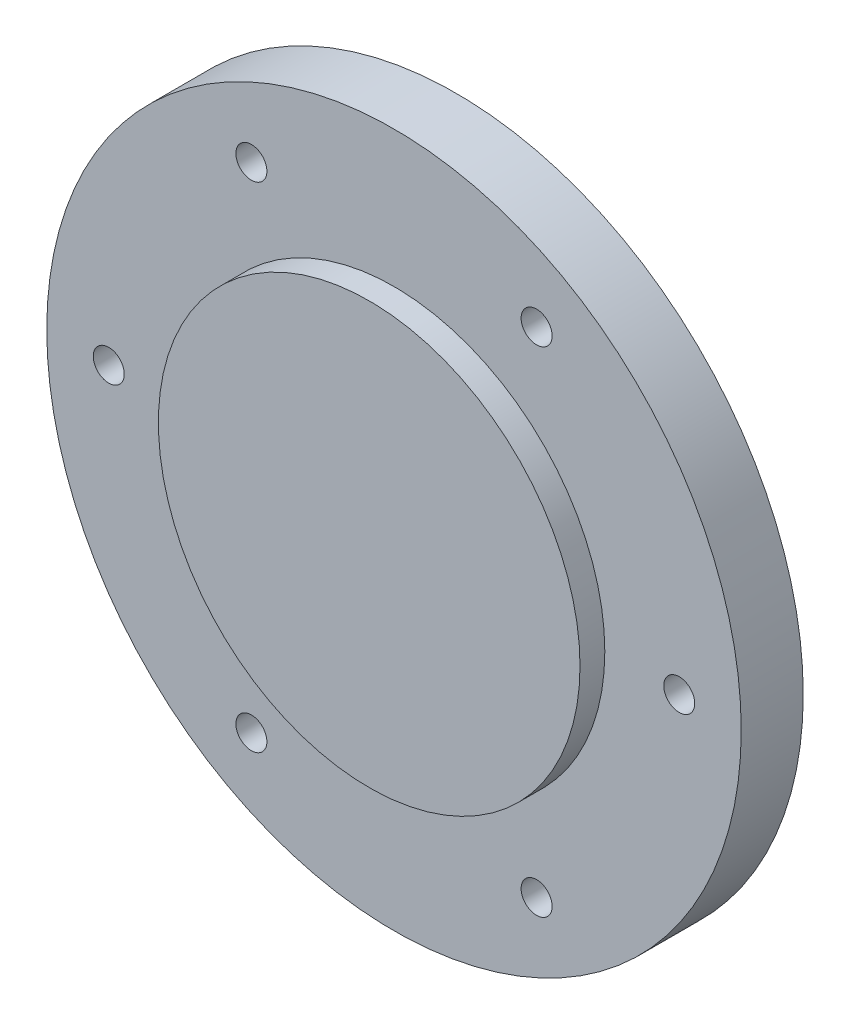
ISO-10303-21;
HEADER;
FILE_DESCRIPTION(('STEP AP214'),'2;1');
FILE_NAME('part.step','',(''),(''),'','','');
FILE_SCHEMA(('AUTOMOTIVE_DESIGN { 1 0 10303 214 1 1 1 1 }'));
ENDSEC;
DATA;
#1=APPLICATION_CONTEXT('core data for automotive mechanical design processes');
#2=APPLICATION_PROTOCOL_DEFINITION('international standard','automotive_design',2000,#1);
#3=PRODUCT_CONTEXT('',#1,'mechanical');
#4=PRODUCT('Part','Part','',(#3));
#5=PRODUCT_RELATED_PRODUCT_CATEGORY('part','',(#4));
#6=PRODUCT_DEFINITION_FORMATION('','',#4);
#7=PRODUCT_DEFINITION_CONTEXT('part definition',#1,'design');
#8=PRODUCT_DEFINITION('design','',#6,#7);
#9=PRODUCT_DEFINITION_SHAPE('','',#8);
#10=(LENGTH_UNIT() NAMED_UNIT(*) SI_UNIT(.MILLI.,.METRE.));
#11=(NAMED_UNIT(*) PLANE_ANGLE_UNIT() SI_UNIT($,.RADIAN.));
#12=(NAMED_UNIT(*) SI_UNIT($,.STERADIAN.) SOLID_ANGLE_UNIT());
#13=UNCERTAINTY_MEASURE_WITH_UNIT(LENGTH_MEASURE(1.E-05),#10,'distance_accuracy_value','');
#14=(GEOMETRIC_REPRESENTATION_CONTEXT(3) GLOBAL_UNCERTAINTY_ASSIGNED_CONTEXT((#13)) GLOBAL_UNIT_ASSIGNED_CONTEXT((#10,
#11,#12)) REPRESENTATION_CONTEXT('',''));
#15=CARTESIAN_POINT('',(0.,0.,0.));
#16=DIRECTION('',(0.,0.,1.));
#17=DIRECTION('',(1.,0.,0.));
#18=AXIS2_PLACEMENT_3D('',#15,#16,#17);
#19=CARTESIAN_POINT('',(0.,0.,5.));
#20=DIRECTION('',(0.,0.,-1.));
#21=DIRECTION('',(-1.,0.,0.));
#22=AXIS2_PLACEMENT_3D('',#19,#20,#21);
#23=CYLINDRICAL_SURFACE('',#22,28.);
#24=CARTESIAN_POINT('',(0.,0.,5.));
#25=DIRECTION('',(0.,0.,1.));
#26=DIRECTION('',(1.,0.,0.));
#27=AXIS2_PLACEMENT_3D('',#24,#25,#26);
#28=CIRCLE('',#27,28.);
#29=CARTESIAN_POINT('',(28.,0.,5.));
#30=VERTEX_POINT('',#29);
#31=EDGE_CURVE('E42',#30,#30,#28,.T.);
#32=ORIENTED_EDGE('',*,*,#31,.F.);
#33=EDGE_LOOP('',(#32));
#34=FACE_BOUND('',#33,.T.);
#35=CARTESIAN_POINT('',(0.,0.,0.));
#36=DIRECTION('',(0.,0.,1.));
#37=DIRECTION('',(1.,0.,0.));
#38=AXIS2_PLACEMENT_3D('',#35,#36,#37);
#39=CIRCLE('',#38,28.);
#40=CARTESIAN_POINT('',(28.,0.,0.));
#41=VERTEX_POINT('',#40);
#42=EDGE_CURVE('E37',#41,#41,#39,.T.);
#43=ORIENTED_EDGE('',*,*,#42,.T.);
#44=EDGE_LOOP('',(#43));
#45=FACE_BOUND('',#44,.T.);
#46=ADVANCED_FACE('F40',(#34,#45),#23,.T.);
#47=CARTESIAN_POINT('',(0.,0.,5.));
#48=DIRECTION('',(0.,0.,1.));
#49=DIRECTION('',(1.,0.,0.));
#50=AXIS2_PLACEMENT_3D('',#47,#48,#49);
#51=PLANE('',#50);
#52=CARTESIAN_POINT('',(11.5,-19.9185842870421,5.));
#53=DIRECTION('',(0.,0.,1.));
#54=DIRECTION('',(0.499999999999999,-0.866025403784439,0.));
#55=AXIS2_PLACEMENT_3D('',#52,#53,#54);
#56=CIRCLE('',#55,1.25);
#57=CARTESIAN_POINT('',(12.125,-21.0011160417726,5.));
#58=VERTEX_POINT('',#57);
#59=EDGE_CURVE('E66',#58,#58,#56,.T.);
#60=ORIENTED_EDGE('',*,*,#59,.F.);
#61=EDGE_LOOP('',(#60));
#62=FACE_BOUND('',#61,.T.);
#63=CARTESIAN_POINT('',(-11.5,-19.9185842870421,5.));
#64=DIRECTION('',(0.,0.,1.));
#65=DIRECTION('',(-0.5,-0.866025403784438,0.));
#66=AXIS2_PLACEMENT_3D('',#63,#64,#65);
#67=CIRCLE('',#66,1.25);
#68=CARTESIAN_POINT('',(-12.125,-21.0011160417726,5.));
#69=VERTEX_POINT('',#68);
#70=EDGE_CURVE('E75',#69,#69,#67,.T.);
#71=ORIENTED_EDGE('',*,*,#70,.F.);
#72=EDGE_LOOP('',(#71));
#73=FACE_BOUND('',#72,.T.);
#74=CARTESIAN_POINT('',(-23.,0.,5.));
#75=DIRECTION('',(0.,0.,1.));
#76=DIRECTION('',(-1.,0.,0.));
#77=AXIS2_PLACEMENT_3D('',#74,#75,#76);
#78=CIRCLE('',#77,1.25);
#79=CARTESIAN_POINT('',(-24.25,0.,5.));
#80=VERTEX_POINT('',#79);
#81=EDGE_CURVE('E80',#80,#80,#78,.T.);
#82=ORIENTED_EDGE('',*,*,#81,.F.);
#83=EDGE_LOOP('',(#82));
#84=FACE_BOUND('',#83,.T.);
#85=CARTESIAN_POINT('',(-11.5,19.9185842870421,5.));
#86=DIRECTION('',(0.,0.,1.));
#87=DIRECTION('',(-0.5,0.866025403784439,0.));
#88=AXIS2_PLACEMENT_3D('',#85,#86,#87);
#89=CIRCLE('',#88,1.25);
#90=CARTESIAN_POINT('',(-12.125,21.0011160417726,5.));
#91=VERTEX_POINT('',#90);
#92=EDGE_CURVE('E83',#91,#91,#89,.T.);
#93=ORIENTED_EDGE('',*,*,#92,.F.);
#94=EDGE_LOOP('',(#93));
#95=FACE_BOUND('',#94,.T.);
#96=CARTESIAN_POINT('',(11.5,19.9185842870421,5.));
#97=DIRECTION('',(0.,0.,1.));
#98=DIRECTION('',(0.5,0.866025403784439,0.));
#99=AXIS2_PLACEMENT_3D('',#96,#97,#98);
#100=CIRCLE('',#99,1.25);
#101=CARTESIAN_POINT('',(12.125,21.0011160417726,5.));
#102=VERTEX_POINT('',#101);
#103=EDGE_CURVE('E58',#102,#102,#100,.T.);
#104=ORIENTED_EDGE('',*,*,#103,.F.);
#105=EDGE_LOOP('',(#104));
#106=FACE_BOUND('',#105,.T.);
#107=CARTESIAN_POINT('',(23.,0.,5.));
#108=DIRECTION('',(0.,0.,1.));
#109=DIRECTION('',(1.,0.,0.));
#110=AXIS2_PLACEMENT_3D('',#107,#108,#109);
#111=CIRCLE('',#110,1.25);
#112=CARTESIAN_POINT('',(24.25,0.,5.));
#113=VERTEX_POINT('',#112);
#114=EDGE_CURVE('E53',#113,#113,#111,.T.);
#115=ORIENTED_EDGE('',*,*,#114,.F.);
#116=EDGE_LOOP('',(#115));
#117=FACE_BOUND('',#116,.T.);
#118=CARTESIAN_POINT('',(0.,0.,5.));
#119=DIRECTION('',(0.,0.,1.));
#120=DIRECTION('',(1.,0.,0.));
#121=AXIS2_PLACEMENT_3D('',#118,#119,#120);
#122=CIRCLE('',#121,17.);
#123=CARTESIAN_POINT('',(17.,0.,5.));
#124=VERTEX_POINT('',#123);
#125=EDGE_CURVE('E10',#124,#124,#122,.T.);
#126=ORIENTED_EDGE('',*,*,#125,.F.);
#127=EDGE_LOOP('',(#126));
#128=FACE_BOUND('',#127,.T.);
#129=ORIENTED_EDGE('',*,*,#31,.T.);
#130=EDGE_LOOP('',(#129));
#131=FACE_BOUND('',#130,.T.);
#132=ADVANCED_FACE('F101',(#62,#73,#84,#95,#106,#117,#128,#131),#51,.T.);
#133=CARTESIAN_POINT('',(0.,0.,0.));
#134=DIRECTION('',(0.,0.,1.));
#135=DIRECTION('',(1.,0.,0.));
#136=AXIS2_PLACEMENT_3D('',#133,#134,#135);
#137=PLANE('',#136);
#138=CARTESIAN_POINT('',(11.5,-19.9185842870421,0.));
#139=DIRECTION('',(0.,0.,1.));
#140=DIRECTION('',(0.499999999999999,-0.866025403784439,0.));
#141=AXIS2_PLACEMENT_3D('',#138,#139,#140);
#142=CIRCLE('',#141,1.25);
#143=CARTESIAN_POINT('',(12.125,-21.0011160417726,0.));
#144=VERTEX_POINT('',#143);
#145=EDGE_CURVE('E68',#144,#144,#142,.T.);
#146=ORIENTED_EDGE('',*,*,#145,.T.);
#147=EDGE_LOOP('',(#146));
#148=FACE_BOUND('',#147,.T.);
#149=CARTESIAN_POINT('',(-11.5,-19.9185842870421,0.));
#150=DIRECTION('',(0.,0.,1.));
#151=DIRECTION('',(-0.5,-0.866025403784438,0.));
#152=AXIS2_PLACEMENT_3D('',#149,#150,#151);
#153=CIRCLE('',#152,1.25);
#154=CARTESIAN_POINT('',(-12.125,-21.0011160417726,0.));
#155=VERTEX_POINT('',#154);
#156=EDGE_CURVE('E73',#155,#155,#153,.T.);
#157=ORIENTED_EDGE('',*,*,#156,.T.);
#158=EDGE_LOOP('',(#157));
#159=FACE_BOUND('',#158,.T.);
#160=CARTESIAN_POINT('',(-23.,0.,0.));
#161=DIRECTION('',(0.,0.,1.));
#162=DIRECTION('',(-1.,0.,0.));
#163=AXIS2_PLACEMENT_3D('',#160,#161,#162);
#164=CIRCLE('',#163,1.25);
#165=CARTESIAN_POINT('',(-24.25,0.,0.));
#166=VERTEX_POINT('',#165);
#167=EDGE_CURVE('E81',#166,#166,#164,.T.);
#168=ORIENTED_EDGE('',*,*,#167,.T.);
#169=EDGE_LOOP('',(#168));
#170=FACE_BOUND('',#169,.T.);
#171=CARTESIAN_POINT('',(-11.5,19.9185842870421,0.));
#172=DIRECTION('',(0.,0.,1.));
#173=DIRECTION('',(-0.5,0.866025403784439,0.));
#174=AXIS2_PLACEMENT_3D('',#171,#172,#173);
#175=CIRCLE('',#174,1.25);
#176=CARTESIAN_POINT('',(-12.125,21.0011160417726,0.));
#177=VERTEX_POINT('',#176);
#178=EDGE_CURVE('E65',#177,#177,#175,.T.);
#179=ORIENTED_EDGE('',*,*,#178,.T.);
#180=EDGE_LOOP('',(#179));
#181=FACE_BOUND('',#180,.T.);
#182=CARTESIAN_POINT('',(11.5,19.9185842870421,0.));
#183=DIRECTION('',(0.,0.,1.));
#184=DIRECTION('',(0.5,0.866025403784439,0.));
#185=AXIS2_PLACEMENT_3D('',#182,#183,#184);
#186=CIRCLE('',#185,1.25);
#187=CARTESIAN_POINT('',(12.125,21.0011160417726,0.));
#188=VERTEX_POINT('',#187);
#189=EDGE_CURVE('E60',#188,#188,#186,.T.);
#190=ORIENTED_EDGE('',*,*,#189,.T.);
#191=EDGE_LOOP('',(#190));
#192=FACE_BOUND('',#191,.T.);
#193=CARTESIAN_POINT('',(23.,0.,0.));
#194=DIRECTION('',(0.,0.,1.));
#195=DIRECTION('',(1.,0.,0.));
#196=AXIS2_PLACEMENT_3D('',#193,#194,#195);
#197=CIRCLE('',#196,1.25);
#198=CARTESIAN_POINT('',(24.25,0.,0.));
#199=VERTEX_POINT('',#198);
#200=EDGE_CURVE('E52',#199,#199,#197,.T.);
#201=ORIENTED_EDGE('',*,*,#200,.T.);
#202=EDGE_LOOP('',(#201));
#203=FACE_BOUND('',#202,.T.);
#204=ORIENTED_EDGE('',*,*,#42,.F.);
#205=EDGE_LOOP('',(#204));
#206=FACE_BOUND('',#205,.T.);
#207=ADVANCED_FACE('F89',(#148,#159,#170,#181,#192,#203,#206),#137,.F.);
#208=CARTESIAN_POINT('',(0.,0.,7.));
#209=DIRECTION('',(0.,0.,-1.));
#210=DIRECTION('',(-1.,0.,0.));
#211=AXIS2_PLACEMENT_3D('',#208,#209,#210);
#212=CYLINDRICAL_SURFACE('',#211,17.);
#213=CARTESIAN_POINT('',(0.,0.,7.));
#214=DIRECTION('',(0.,0.,1.));
#215=DIRECTION('',(1.,0.,0.));
#216=AXIS2_PLACEMENT_3D('',#213,#214,#215);
#217=CIRCLE('',#216,17.);
#218=CARTESIAN_POINT('',(17.,0.,7.));
#219=VERTEX_POINT('',#218);
#220=EDGE_CURVE('E49',#219,#219,#217,.T.);
#221=ORIENTED_EDGE('',*,*,#220,.F.);
#222=EDGE_LOOP('',(#221));
#223=FACE_BOUND('',#222,.T.);
#224=ORIENTED_EDGE('',*,*,#125,.T.);
#225=EDGE_LOOP('',(#224));
#226=FACE_BOUND('',#225,.T.);
#227=ADVANCED_FACE('F118',(#223,#226),#212,.T.);
#228=CARTESIAN_POINT('',(0.,0.,7.));
#229=DIRECTION('',(0.,0.,1.));
#230=DIRECTION('',(1.,0.,0.));
#231=AXIS2_PLACEMENT_3D('',#228,#229,#230);
#232=PLANE('',#231);
#233=ORIENTED_EDGE('',*,*,#220,.T.);
#234=EDGE_LOOP('',(#233));
#235=FACE_BOUND('',#234,.T.);
#236=ADVANCED_FACE('F125',(#235),#232,.T.);
#237=CARTESIAN_POINT('',(23.,0.,0.));
#238=DIRECTION('',(0.,0.,1.));
#239=DIRECTION('',(1.,0.,0.));
#240=AXIS2_PLACEMENT_3D('',#237,#238,#239);
#241=CYLINDRICAL_SURFACE('',#240,1.25);
#242=ORIENTED_EDGE('',*,*,#200,.F.);
#243=EDGE_LOOP('',(#242));
#244=FACE_BOUND('',#243,.T.);
#245=ORIENTED_EDGE('',*,*,#114,.T.);
#246=EDGE_LOOP('',(#245));
#247=FACE_BOUND('',#246,.T.);
#248=ADVANCED_FACE('F131',(#244,#247),#241,.F.);
#249=CARTESIAN_POINT('',(11.5,19.9185842870421,0.));
#250=DIRECTION('',(0.,0.,1.));
#251=DIRECTION('',(1.,0.,0.));
#252=AXIS2_PLACEMENT_3D('',#249,#250,#251);
#253=CYLINDRICAL_SURFACE('',#252,1.25);
#254=ORIENTED_EDGE('',*,*,#189,.F.);
#255=EDGE_LOOP('',(#254));
#256=FACE_BOUND('',#255,.T.);
#257=ORIENTED_EDGE('',*,*,#103,.T.);
#258=EDGE_LOOP('',(#257));
#259=FACE_BOUND('',#258,.T.);
#260=ADVANCED_FACE('F100',(#256,#259),#253,.F.);
#261=CARTESIAN_POINT('',(-11.5,19.9185842870421,0.));
#262=DIRECTION('',(0.,0.,1.));
#263=DIRECTION('',(1.,0.,0.));
#264=AXIS2_PLACEMENT_3D('',#261,#262,#263);
#265=CYLINDRICAL_SURFACE('',#264,1.25);
#266=ORIENTED_EDGE('',*,*,#178,.F.);
#267=EDGE_LOOP('',(#266));
#268=FACE_BOUND('',#267,.T.);
#269=ORIENTED_EDGE('',*,*,#92,.T.);
#270=EDGE_LOOP('',(#269));
#271=FACE_BOUND('',#270,.T.);
#272=ADVANCED_FACE('F91',(#268,#271),#265,.F.);
#273=CARTESIAN_POINT('',(-23.,0.,0.));
#274=DIRECTION('',(0.,0.,1.));
#275=DIRECTION('',(1.,0.,0.));
#276=AXIS2_PLACEMENT_3D('',#273,#274,#275);
#277=CYLINDRICAL_SURFACE('',#276,1.25);
#278=ORIENTED_EDGE('',*,*,#167,.F.);
#279=EDGE_LOOP('',(#278));
#280=FACE_BOUND('',#279,.T.);
#281=ORIENTED_EDGE('',*,*,#81,.T.);
#282=EDGE_LOOP('',(#281));
#283=FACE_BOUND('',#282,.T.);
#284=ADVANCED_FACE('F96',(#280,#283),#277,.F.);
#285=CARTESIAN_POINT('',(-11.5,-19.9185842870421,0.));
#286=DIRECTION('',(0.,0.,1.));
#287=DIRECTION('',(1.,0.,0.));
#288=AXIS2_PLACEMENT_3D('',#285,#286,#287);
#289=CYLINDRICAL_SURFACE('',#288,1.25);
#290=ORIENTED_EDGE('',*,*,#156,.F.);
#291=EDGE_LOOP('',(#290));
#292=FACE_BOUND('',#291,.T.);
#293=ORIENTED_EDGE('',*,*,#70,.T.);
#294=EDGE_LOOP('',(#293));
#295=FACE_BOUND('',#294,.T.);
#296=ADVANCED_FACE('F142',(#292,#295),#289,.F.);
#297=CARTESIAN_POINT('',(11.5,-19.9185842870421,0.));
#298=DIRECTION('',(0.,0.,1.));
#299=DIRECTION('',(1.,0.,0.));
#300=AXIS2_PLACEMENT_3D('',#297,#298,#299);
#301=CYLINDRICAL_SURFACE('',#300,1.25);
#302=ORIENTED_EDGE('',*,*,#145,.F.);
#303=EDGE_LOOP('',(#302));
#304=FACE_BOUND('',#303,.T.);
#305=ORIENTED_EDGE('',*,*,#59,.T.);
#306=EDGE_LOOP('',(#305));
#307=FACE_BOUND('',#306,.T.);
#308=ADVANCED_FACE('F138',(#304,#307),#301,.F.);
#309=CLOSED_SHELL('',(#46,#132,#207,#227,#236,#248,#260,#272,#284,#296,#308));
#310=MANIFOLD_SOLID_BREP('B2',#309);
#311=ADVANCED_BREP_SHAPE_REPRESENTATION('',(#18,#310),#14);
#312=SHAPE_DEFINITION_REPRESENTATION(#9,#311);
ENDSEC;
END-ISO-10303-21;
